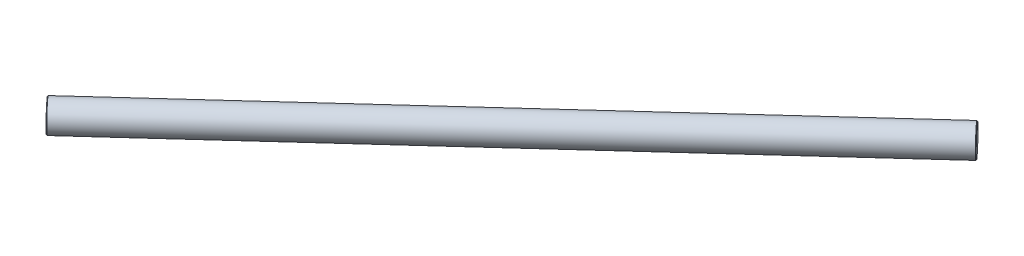
ISO-10303-21;
HEADER;
FILE_DESCRIPTION(('STEP AP214'),'2;1');
FILE_NAME('part.step','',(''),(''),'','','');
FILE_SCHEMA(('AUTOMOTIVE_DESIGN { 1 0 10303 214 1 1 1 1 }'));
ENDSEC;
DATA;
#1=APPLICATION_CONTEXT('core data for automotive mechanical design processes');
#2=APPLICATION_PROTOCOL_DEFINITION('international standard','automotive_design',2000,#1);
#3=PRODUCT_CONTEXT('',#1,'mechanical');
#4=PRODUCT('Part','Part','',(#3));
#5=PRODUCT_RELATED_PRODUCT_CATEGORY('part','',(#4));
#6=PRODUCT_DEFINITION_FORMATION('','',#4);
#7=PRODUCT_DEFINITION_CONTEXT('part definition',#1,'design');
#8=PRODUCT_DEFINITION('design','',#6,#7);
#9=PRODUCT_DEFINITION_SHAPE('','',#8);
#10=(LENGTH_UNIT() NAMED_UNIT(*) SI_UNIT(.MILLI.,.METRE.));
#11=(NAMED_UNIT(*) PLANE_ANGLE_UNIT() SI_UNIT($,.RADIAN.));
#12=(NAMED_UNIT(*) SI_UNIT($,.STERADIAN.) SOLID_ANGLE_UNIT());
#13=UNCERTAINTY_MEASURE_WITH_UNIT(LENGTH_MEASURE(1.E-05),#10,'distance_accuracy_value','');
#14=(GEOMETRIC_REPRESENTATION_CONTEXT(3) GLOBAL_UNCERTAINTY_ASSIGNED_CONTEXT((#13)) GLOBAL_UNIT_ASSIGNED_CONTEXT((#10,
#11,#12)) REPRESENTATION_CONTEXT('',''));
#15=CARTESIAN_POINT('',(0.,0.,0.));
#16=DIRECTION('',(0.,0.,1.));
#17=DIRECTION('',(1.,0.,0.));
#18=AXIS2_PLACEMENT_3D('',#15,#16,#17);
#19=CARTESIAN_POINT('',(-91.6637022397042,14.8082,-282.552746295608));
#20=DIRECTION('',(-0.739139866909713,0.,0.673551970633813));
#21=DIRECTION('',(0.673551970633813,0.,0.739139866909713));
#22=AXIS2_PLACEMENT_3D('',#19,#20,#21);
#23=CYLINDRICAL_SURFACE('',#22,1.0922);
#24=CARTESIAN_POINT('',(-129.179715936212,14.8082,-248.365732325903));
#25=DIRECTION('',(0.739139866909713,0.,-0.673551970633813));
#26=DIRECTION('',(-0.673551970633813,0.,-0.739139866909713));
#27=AXIS2_PLACEMENT_3D('',#24,#25,#26);
#28=CIRCLE('',#27,1.0922);
#29=CARTESIAN_POINT('',(-129.915369398538,14.8082,-249.173020888542));
#30=VERTEX_POINT('',#29);
#31=EDGE_CURVE('E50',#30,#30,#28,.T.);
#32=ORIENTED_EDGE('',*,*,#31,.T.);
#33=EDGE_LOOP('',(#32));
#34=FACE_BOUND('',#33,.T.);
#35=CARTESIAN_POINT('',(-91.6959937822097,14.8082,-282.523320157115));
#36=DIRECTION('',(0.739139866909713,0.,-0.673551970633813));
#37=DIRECTION('',(-0.673551970633813,0.,-0.739139866909713));
#38=AXIS2_PLACEMENT_3D('',#35,#36,#37);
#39=CIRCLE('',#38,1.0922);
#40=CARTESIAN_POINT('',(-92.4316472445359,14.8082,-283.330608719754));
#41=VERTEX_POINT('',#40);
#42=EDGE_CURVE('E54',#41,#41,#39,.F.);
#43=ORIENTED_EDGE('',*,*,#42,.T.);
#44=EDGE_LOOP('',(#43));
#45=FACE_BOUND('',#44,.T.);
#46=ADVANCED_FACE('F39',(#34,#45),#23,.T.);
#47=CARTESIAN_POINT('',(-91.6637022397042,14.8082,-282.552746295608));
#48=DIRECTION('',(0.739139866909713,0.,-0.673551970633813));
#49=DIRECTION('',(-0.673551970633813,0.,-0.739139866909713));
#50=AXIS2_PLACEMENT_3D('',#47,#48,#49);
#51=PLANE('',#50);
#52=CARTESIAN_POINT('',(-91.6637022397042,14.8082,-282.552746295608));
#53=DIRECTION('',(0.739139866909713,0.,-0.673551970633813));
#54=DIRECTION('',(-0.673551970633813,0.,-0.739139866909713));
#55=AXIS2_PLACEMENT_3D('',#52,#53,#54);
#56=CIRCLE('',#55,1.048512);
#57=CARTESIAN_POINT('',(-92.3699295635374,14.8082,-283.327743315741));
#58=VERTEX_POINT('',#57);
#59=EDGE_CURVE('E10',#58,#58,#56,.T.);
#60=ORIENTED_EDGE('',*,*,#59,.T.);
#61=EDGE_LOOP('',(#60));
#62=FACE_BOUND('',#61,.T.);
#63=ADVANCED_FACE('F71',(#62),#51,.T.);
#64=CARTESIAN_POINT('',(-129.212007478718,14.8082,-248.33630618741));
#65=DIRECTION('',(0.739139866909713,0.,-0.673551970633813));
#66=DIRECTION('',(-0.673551970633813,0.,-0.739139866909713));
#67=AXIS2_PLACEMENT_3D('',#64,#65,#66);
#68=PLANE('',#67);
#69=CARTESIAN_POINT('',(-129.212007478718,14.8082,-248.33630618741));
#70=DIRECTION('',(0.739139866909713,0.,-0.673551970633813));
#71=DIRECTION('',(-0.673551970633813,0.,-0.739139866909713));
#72=AXIS2_PLACEMENT_3D('',#69,#70,#71);
#73=CIRCLE('',#72,1.04851199999999);
#74=CARTESIAN_POINT('',(-129.918234802551,14.8082,-249.111303207543));
#75=VERTEX_POINT('',#74);
#76=EDGE_CURVE('E46',#75,#75,#73,.F.);
#77=ORIENTED_EDGE('',*,*,#76,.T.);
#78=EDGE_LOOP('',(#77));
#79=FACE_BOUND('',#78,.T.);
#80=ADVANCED_FACE('F68',(#79),#68,.F.);
#81=CARTESIAN_POINT('',(-129.179715936212,14.8082,-248.365732325903));
#82=DIRECTION('',(0.739139866909713,0.,-0.673551970633813));
#83=DIRECTION('',(-0.673551970633813,0.,-0.739139866909713));
#84=AXIS2_PLACEMENT_3D('',#81,#82,#83);
#85=CONICAL_SURFACE('',#84,1.0922,0.78539816339751);
#86=ORIENTED_EDGE('',*,*,#76,.F.);
#87=EDGE_LOOP('',(#86));
#88=FACE_BOUND('',#87,.T.);
#89=ORIENTED_EDGE('',*,*,#31,.F.);
#90=EDGE_LOOP('',(#89));
#91=FACE_BOUND('',#90,.T.);
#92=ADVANCED_FACE('F63',(#88,#91),#85,.T.);
#93=CARTESIAN_POINT('',(-91.6637022397042,14.8082,-282.552746295608));
#94=DIRECTION('',(-0.739139866909713,0.,0.673551970633813));
#95=DIRECTION('',(0.673551970633813,0.,0.739139866909713));
#96=AXIS2_PLACEMENT_3D('',#93,#94,#95);
#97=CONICAL_SURFACE('',#96,1.048512,0.785398163397431);
#98=ORIENTED_EDGE('',*,*,#42,.F.);
#99=EDGE_LOOP('',(#98));
#100=FACE_BOUND('',#99,.T.);
#101=ORIENTED_EDGE('',*,*,#59,.F.);
#102=EDGE_LOOP('',(#101));
#103=FACE_BOUND('',#102,.T.);
#104=ADVANCED_FACE('F41',(#100,#103),#97,.T.);
#105=CLOSED_SHELL('',(#46,#63,#80,#92,#104));
#106=MANIFOLD_SOLID_BREP('B2',#105);
#107=ADVANCED_BREP_SHAPE_REPRESENTATION('',(#18,#106),#14);
#108=SHAPE_DEFINITION_REPRESENTATION(#9,#107);
ENDSEC;
END-ISO-10303-21;
